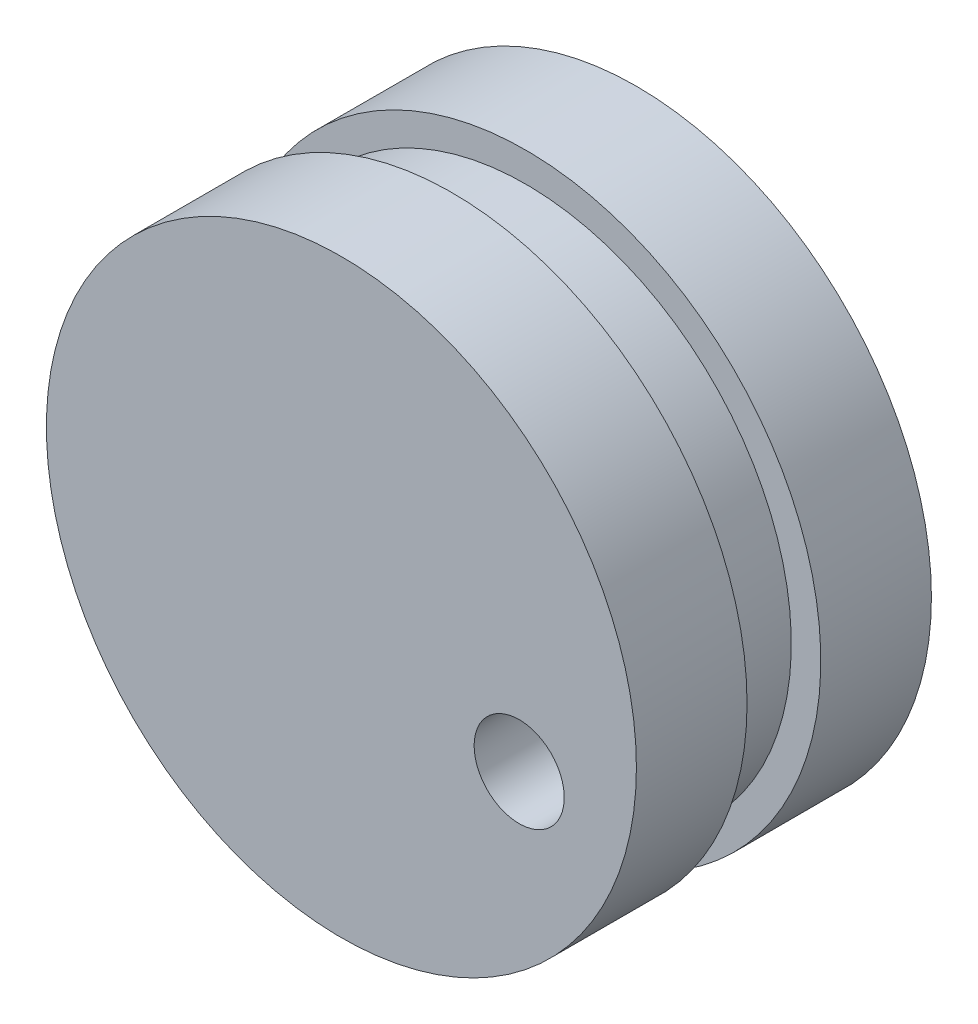
ISO-10303-21;
HEADER;
FILE_DESCRIPTION(('STEP AP214'),'2;1');
FILE_NAME('part.step','',(''),(''),'','','');
FILE_SCHEMA(('AUTOMOTIVE_DESIGN { 1 0 10303 214 1 1 1 1 }'));
ENDSEC;
DATA;
#1=APPLICATION_CONTEXT('core data for automotive mechanical design processes');
#2=APPLICATION_PROTOCOL_DEFINITION('international standard','automotive_design',2000,#1);
#3=PRODUCT_CONTEXT('',#1,'mechanical');
#4=PRODUCT('Part','Part','',(#3));
#5=PRODUCT_RELATED_PRODUCT_CATEGORY('part','',(#4));
#6=PRODUCT_DEFINITION_FORMATION('','',#4);
#7=PRODUCT_DEFINITION_CONTEXT('part definition',#1,'design');
#8=PRODUCT_DEFINITION('design','',#6,#7);
#9=PRODUCT_DEFINITION_SHAPE('','',#8);
#10=(LENGTH_UNIT() NAMED_UNIT(*) SI_UNIT(.MILLI.,.METRE.));
#11=(NAMED_UNIT(*) PLANE_ANGLE_UNIT() SI_UNIT($,.RADIAN.));
#12=(NAMED_UNIT(*) SI_UNIT($,.STERADIAN.) SOLID_ANGLE_UNIT());
#13=UNCERTAINTY_MEASURE_WITH_UNIT(LENGTH_MEASURE(1.E-05),#10,'distance_accuracy_value','');
#14=(GEOMETRIC_REPRESENTATION_CONTEXT(3) GLOBAL_UNCERTAINTY_ASSIGNED_CONTEXT((#13)) GLOBAL_UNIT_ASSIGNED_CONTEXT((#10,
#11,#12)) REPRESENTATION_CONTEXT('',''));
#15=CARTESIAN_POINT('',(0.,0.,0.));
#16=DIRECTION('',(0.,0.,1.));
#17=DIRECTION('',(1.,0.,0.));
#18=AXIS2_PLACEMENT_3D('',#15,#16,#17);
#19=CARTESIAN_POINT('',(0.,0.,20.));
#20=DIRECTION('',(0.,0.,-1.));
#21=DIRECTION('',(-1.,0.,0.));
#22=AXIS2_PLACEMENT_3D('',#19,#20,#21);
#23=CYLINDRICAL_SURFACE('',#22,20.);
#24=CARTESIAN_POINT('',(0.,0.,12.5));
#25=DIRECTION('',(0.,0.,1.));
#26=DIRECTION('',(1.,0.,0.));
#27=AXIS2_PLACEMENT_3D('',#24,#25,#26);
#28=CIRCLE('',#27,20.);
#29=CARTESIAN_POINT('',(20.,0.,12.5));
#30=VERTEX_POINT('',#29);
#31=EDGE_CURVE('E35',#30,#30,#28,.T.);
#32=ORIENTED_EDGE('',*,*,#31,.T.);
#33=EDGE_LOOP('',(#32));
#34=FACE_BOUND('',#33,.T.);
#35=CARTESIAN_POINT('',(0.,0.,20.));
#36=DIRECTION('',(0.,0.,1.));
#37=DIRECTION('',(1.,0.,0.));
#38=AXIS2_PLACEMENT_3D('',#35,#36,#37);
#39=CIRCLE('',#38,20.);
#40=CARTESIAN_POINT('',(20.,0.,20.));
#41=VERTEX_POINT('',#40);
#42=EDGE_CURVE('E10',#41,#41,#39,.T.);
#43=ORIENTED_EDGE('',*,*,#42,.F.);
#44=EDGE_LOOP('',(#43));
#45=FACE_BOUND('',#44,.T.);
#46=ADVANCED_FACE('F31',(#34,#45),#23,.T.);
#47=CARTESIAN_POINT('',(0.,0.,20.));
#48=DIRECTION('',(0.,0.,1.));
#49=DIRECTION('',(1.,0.,0.));
#50=AXIS2_PLACEMENT_3D('',#47,#48,#49);
#51=PLANE('',#50);
#52=CARTESIAN_POINT('',(12.0524977784271,-4.21815649070822,20.));
#53=DIRECTION('',(0.,0.,-1.));
#54=DIRECTION('',(-1.,0.,0.));
#55=AXIS2_PLACEMENT_3D('',#52,#53,#54);
#56=CIRCLE('',#55,3.05555082669746);
#57=CARTESIAN_POINT('',(8.99694695172964,-4.21815649070822,20.));
#58=VERTEX_POINT('',#57);
#59=EDGE_CURVE('E58',#58,#58,#56,.T.);
#60=ORIENTED_EDGE('',*,*,#59,.T.);
#61=EDGE_LOOP('',(#60));
#62=FACE_BOUND('',#61,.T.);
#63=ORIENTED_EDGE('',*,*,#42,.T.);
#64=EDGE_LOOP('',(#63));
#65=FACE_BOUND('',#64,.T.);
#66=ADVANCED_FACE('F83',(#62,#65),#51,.T.);
#67=CARTESIAN_POINT('',(0.,20.9127789910135,12.5));
#68=DIRECTION('',(0.,0.,1.));
#69=DIRECTION('',(1.,0.,0.));
#70=AXIS2_PLACEMENT_3D('',#67,#68,#69);
#71=PLANE('',#70);
#72=CARTESIAN_POINT('',(0.,0.,12.5));
#73=DIRECTION('',(0.,0.,-1.));
#74=DIRECTION('',(-1.,0.,0.));
#75=AXIS2_PLACEMENT_3D('',#72,#73,#74);
#76=CIRCLE('',#75,18.);
#77=CARTESIAN_POINT('',(-18.,0.,12.5));
#78=VERTEX_POINT('',#77);
#79=EDGE_CURVE('E46',#78,#78,#76,.T.);
#80=ORIENTED_EDGE('',*,*,#79,.F.);
#81=EDGE_LOOP('',(#80));
#82=FACE_BOUND('',#81,.T.);
#83=ORIENTED_EDGE('',*,*,#31,.F.);
#84=EDGE_LOOP('',(#83));
#85=FACE_BOUND('',#84,.T.);
#86=ADVANCED_FACE('F88',(#82,#85),#71,.F.);
#87=CARTESIAN_POINT('',(0.,20.9127789910135,7.5));
#88=DIRECTION('',(0.,0.,-1.));
#89=DIRECTION('',(-1.,0.,0.));
#90=AXIS2_PLACEMENT_3D('',#87,#88,#89);
#91=PLANE('',#90);
#92=CARTESIAN_POINT('',(0.,0.,7.5));
#93=DIRECTION('',(0.,0.,-1.));
#94=DIRECTION('',(-1.,0.,0.));
#95=AXIS2_PLACEMENT_3D('',#92,#93,#94);
#96=CIRCLE('',#95,18.);
#97=CARTESIAN_POINT('',(-18.,0.,7.5));
#98=VERTEX_POINT('',#97);
#99=EDGE_CURVE('E54',#98,#98,#96,.T.);
#100=ORIENTED_EDGE('',*,*,#99,.T.);
#101=EDGE_LOOP('',(#100));
#102=FACE_BOUND('',#101,.T.);
#103=CARTESIAN_POINT('',(0.,0.,7.5));
#104=DIRECTION('',(0.,0.,-1.));
#105=DIRECTION('',(-1.,0.,0.));
#106=AXIS2_PLACEMENT_3D('',#103,#104,#105);
#107=CIRCLE('',#106,20.);
#108=CARTESIAN_POINT('',(-20.,0.,7.5));
#109=VERTEX_POINT('',#108);
#110=EDGE_CURVE('E48',#109,#109,#107,.T.);
#111=ORIENTED_EDGE('',*,*,#110,.F.);
#112=EDGE_LOOP('',(#111));
#113=FACE_BOUND('',#112,.T.);
#114=ADVANCED_FACE('F95',(#102,#113),#91,.F.);
#115=CARTESIAN_POINT('',(0.,0.,0.));
#116=DIRECTION('',(0.,0.,-1.));
#117=DIRECTION('',(-1.,0.,0.));
#118=AXIS2_PLACEMENT_3D('',#115,#116,#117);
#119=CYLINDRICAL_SURFACE('',#118,18.);
#120=ORIENTED_EDGE('',*,*,#99,.F.);
#121=EDGE_LOOP('',(#120));
#122=FACE_BOUND('',#121,.T.);
#123=ORIENTED_EDGE('',*,*,#79,.T.);
#124=EDGE_LOOP('',(#123));
#125=FACE_BOUND('',#124,.T.);
#126=ADVANCED_FACE('F73',(#122,#125),#119,.T.);
#127=CARTESIAN_POINT('',(0.,0.,0.));
#128=DIRECTION('',(0.,0.,1.));
#129=DIRECTION('',(1.,0.,0.));
#130=AXIS2_PLACEMENT_3D('',#127,#128,#129);
#131=PLANE('',#130);
#132=CARTESIAN_POINT('',(12.0524977784271,-4.21815649070822,0.));
#133=DIRECTION('',(0.,0.,-1.));
#134=DIRECTION('',(-1.,0.,0.));
#135=AXIS2_PLACEMENT_3D('',#132,#133,#134);
#136=CIRCLE('',#135,3.05555082669746);
#137=CARTESIAN_POINT('',(8.99694695172964,-4.21815649070822,0.));
#138=VERTEX_POINT('',#137);
#139=EDGE_CURVE('E62',#138,#138,#136,.T.);
#140=ORIENTED_EDGE('',*,*,#139,.F.);
#141=EDGE_LOOP('',(#140));
#142=FACE_BOUND('',#141,.T.);
#143=CARTESIAN_POINT('',(0.,0.,0.));
#144=DIRECTION('',(0.,0.,1.));
#145=DIRECTION('',(1.,0.,0.));
#146=AXIS2_PLACEMENT_3D('',#143,#144,#145);
#147=CIRCLE('',#146,20.);
#148=CARTESIAN_POINT('',(20.,0.,0.));
#149=VERTEX_POINT('',#148);
#150=EDGE_CURVE('E39',#149,#149,#147,.T.);
#151=ORIENTED_EDGE('',*,*,#150,.F.);
#152=EDGE_LOOP('',(#151));
#153=FACE_BOUND('',#152,.T.);
#154=ADVANCED_FACE('F70',(#142,#153),#131,.F.);
#155=ORIENTED_EDGE('',*,*,#110,.T.);
#156=EDGE_LOOP('',(#155));
#157=FACE_BOUND('',#156,.T.);
#158=ORIENTED_EDGE('',*,*,#150,.T.);
#159=EDGE_LOOP('',(#158));
#160=FACE_BOUND('',#159,.T.);
#161=ADVANCED_FACE('F33',(#157,#160),#23,.T.);
#162=CARTESIAN_POINT('',(12.0524977784271,-4.21815649070822,20.));
#163=DIRECTION('',(0.,0.,-1.));
#164=DIRECTION('',(-1.,0.,0.));
#165=AXIS2_PLACEMENT_3D('',#162,#163,#164);
#166=CYLINDRICAL_SURFACE('',#165,3.05555082669746);
#167=ORIENTED_EDGE('',*,*,#59,.F.);
#168=EDGE_LOOP('',(#167));
#169=FACE_BOUND('',#168,.T.);
#170=ORIENTED_EDGE('',*,*,#139,.T.);
#171=EDGE_LOOP('',(#170));
#172=FACE_BOUND('',#171,.T.);
#173=ADVANCED_FACE('F68',(#169,#172),#166,.F.);
#174=CLOSED_SHELL('',(#46,#66,#86,#114,#126,#154,#161,#173));
#175=MANIFOLD_SOLID_BREP('B2',#174);
#176=ADVANCED_BREP_SHAPE_REPRESENTATION('',(#18,#175),#14);
#177=SHAPE_DEFINITION_REPRESENTATION(#9,#176);
ENDSEC;
END-ISO-10303-21;
